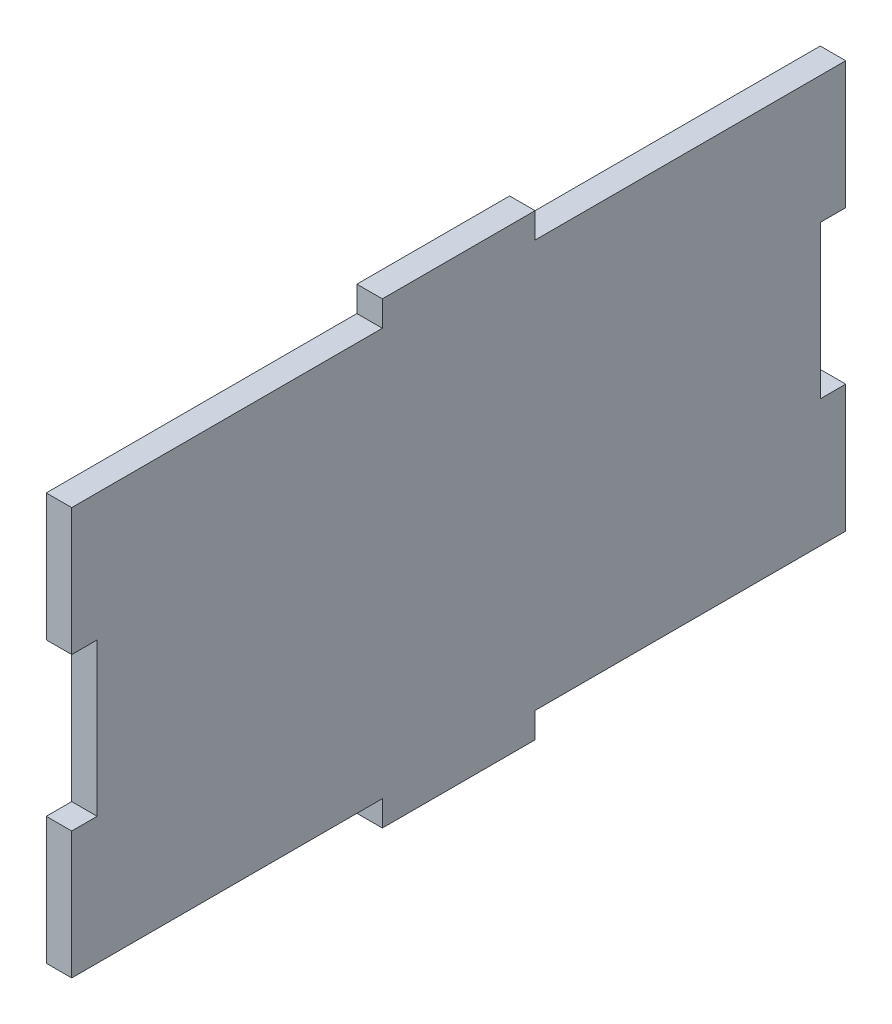
ISO-10303-21;
HEADER;
FILE_DESCRIPTION(('STEP AP214'),'2;1');
FILE_NAME('part.step','',(''),(''),'','','');
FILE_SCHEMA(('AUTOMOTIVE_DESIGN { 1 0 10303 214 1 1 1 1 }'));
ENDSEC;
DATA;
#1=APPLICATION_CONTEXT('core data for automotive mechanical design processes');
#2=APPLICATION_PROTOCOL_DEFINITION('international standard','automotive_design',2000,#1);
#3=PRODUCT_CONTEXT('',#1,'mechanical');
#4=PRODUCT('Part','Part','',(#3));
#5=PRODUCT_RELATED_PRODUCT_CATEGORY('part','',(#4));
#6=PRODUCT_DEFINITION_FORMATION('','',#4);
#7=PRODUCT_DEFINITION_CONTEXT('part definition',#1,'design');
#8=PRODUCT_DEFINITION('design','',#6,#7);
#9=PRODUCT_DEFINITION_SHAPE('','',#8);
#10=(LENGTH_UNIT() NAMED_UNIT(*) SI_UNIT(.MILLI.,.METRE.));
#11=(NAMED_UNIT(*) PLANE_ANGLE_UNIT() SI_UNIT($,.RADIAN.));
#12=(NAMED_UNIT(*) SI_UNIT($,.STERADIAN.) SOLID_ANGLE_UNIT());
#13=UNCERTAINTY_MEASURE_WITH_UNIT(LENGTH_MEASURE(1.E-05),#10,'distance_accuracy_value','');
#14=(GEOMETRIC_REPRESENTATION_CONTEXT(3) GLOBAL_UNCERTAINTY_ASSIGNED_CONTEXT((#13)) GLOBAL_UNIT_ASSIGNED_CONTEXT((#10,
#11,#12)) REPRESENTATION_CONTEXT('',''));
#15=CARTESIAN_POINT('',(0.,0.,0.));
#16=DIRECTION('',(0.,0.,1.));
#17=DIRECTION('',(1.,0.,0.));
#18=AXIS2_PLACEMENT_3D('',#15,#16,#17);
#19=CARTESIAN_POINT('',(3.175,0.,0.));
#20=DIRECTION('',(0.,0.,-1.));
#21=DIRECTION('',(-1.,0.,0.));
#22=AXIS2_PLACEMENT_3D('',#19,#20,#21);
#23=PLANE('',#22);
#24=DIRECTION('',(0.,-1.,0.));
#25=VECTOR('',#24,1.);
#26=CARTESIAN_POINT('',(0.,0.,0.));
#27=LINE('',#26,#25);
#28=CARTESIAN_POINT('',(0.,15.875,0.));
#29=VERTEX_POINT('',#28);
#30=CARTESIAN_POINT('',(0.,0.,0.));
#31=VERTEX_POINT('',#30);
#32=EDGE_CURVE('E200',#29,#31,#27,.T.);
#33=ORIENTED_EDGE('',*,*,#32,.T.);
#34=DIRECTION('',(-1.,0.,0.));
#35=VECTOR('',#34,1.);
#36=CARTESIAN_POINT('',(3.175,0.,0.));
#37=LINE('',#36,#35);
#38=CARTESIAN_POINT('',(3.175,0.,0.));
#39=VERTEX_POINT('',#38);
#40=EDGE_CURVE('E11',#39,#31,#37,.T.);
#41=ORIENTED_EDGE('',*,*,#40,.F.);
#42=DIRECTION('',(0.,-1.,0.));
#43=VECTOR('',#42,1.);
#44=CARTESIAN_POINT('',(3.175,0.,0.));
#45=LINE('',#44,#43);
#46=CARTESIAN_POINT('',(3.175,15.875,0.));
#47=VERTEX_POINT('',#46);
#48=EDGE_CURVE('E238',#47,#39,#45,.T.);
#49=ORIENTED_EDGE('',*,*,#48,.F.);
#50=DIRECTION('',(-1.,0.,0.));
#51=VECTOR('',#50,1.);
#52=CARTESIAN_POINT('',(3.175,15.875,0.));
#53=LINE('',#52,#51);
#54=EDGE_CURVE('E196',#47,#29,#53,.T.);
#55=ORIENTED_EDGE('',*,*,#54,.T.);
#56=EDGE_LOOP('',(#33,#41,#49,#55));
#57=FACE_BOUND('',#56,.T.);
#58=ADVANCED_FACE('F32',(#57),#23,.F.);
#59=CARTESIAN_POINT('',(3.175,0.,0.));
#60=DIRECTION('',(0.,1.,0.));
#61=DIRECTION('',(0.,0.,1.));
#62=AXIS2_PLACEMENT_3D('',#59,#60,#61);
#63=PLANE('',#62);
#64=DIRECTION('',(0.,0.,-1.));
#65=VECTOR('',#64,1.);
#66=CARTESIAN_POINT('',(0.,0.,0.));
#67=LINE('',#66,#65);
#68=CARTESIAN_POINT('',(0.,0.,-38.735));
#69=VERTEX_POINT('',#68);
#70=EDGE_CURVE('E203',#31,#69,#67,.T.);
#71=ORIENTED_EDGE('',*,*,#70,.T.);
#72=DIRECTION('',(-1.,0.,0.));
#73=VECTOR('',#72,1.);
#74=CARTESIAN_POINT('',(3.175,0.,-38.735));
#75=LINE('',#74,#73);
#76=CARTESIAN_POINT('',(3.175,0.,-38.735));
#77=VERTEX_POINT('',#76);
#78=EDGE_CURVE('E40',#77,#69,#75,.T.);
#79=ORIENTED_EDGE('',*,*,#78,.F.);
#80=DIRECTION('',(0.,0.,-1.));
#81=VECTOR('',#80,1.);
#82=CARTESIAN_POINT('',(3.175,0.,0.));
#83=LINE('',#82,#81);
#84=EDGE_CURVE('E127',#39,#77,#83,.T.);
#85=ORIENTED_EDGE('',*,*,#84,.F.);
#86=ORIENTED_EDGE('',*,*,#40,.T.);
#87=EDGE_LOOP('',(#71,#79,#85,#86));
#88=FACE_BOUND('',#87,.T.);
#89=ADVANCED_FACE('F356',(#88),#63,.F.);
#90=CARTESIAN_POINT('',(3.175,0.,-38.735));
#91=DIRECTION('',(0.,0.,-1.));
#92=DIRECTION('',(-1.,0.,0.));
#93=AXIS2_PLACEMENT_3D('',#90,#91,#92);
#94=PLANE('',#93);
#95=DIRECTION('',(0.,-1.,0.));
#96=VECTOR('',#95,1.);
#97=CARTESIAN_POINT('',(0.,0.,-38.735));
#98=LINE('',#97,#96);
#99=CARTESIAN_POINT('',(0.,-3.175,-38.735));
#100=VERTEX_POINT('',#99);
#101=EDGE_CURVE('E205',#69,#100,#98,.T.);
#102=ORIENTED_EDGE('',*,*,#101,.T.);
#103=DIRECTION('',(-1.,0.,0.));
#104=VECTOR('',#103,1.);
#105=CARTESIAN_POINT('',(3.175,-3.175,-38.735));
#106=LINE('',#105,#104);
#107=CARTESIAN_POINT('',(3.175,-3.175,-38.735));
#108=VERTEX_POINT('',#107);
#109=EDGE_CURVE('E281',#108,#100,#106,.T.);
#110=ORIENTED_EDGE('',*,*,#109,.F.);
#111=DIRECTION('',(0.,-1.,0.));
#112=VECTOR('',#111,1.);
#113=CARTESIAN_POINT('',(3.175,0.,-38.735));
#114=LINE('',#113,#112);
#115=EDGE_CURVE('E289',#77,#108,#114,.T.);
#116=ORIENTED_EDGE('',*,*,#115,.F.);
#117=ORIENTED_EDGE('',*,*,#78,.T.);
#118=EDGE_LOOP('',(#102,#110,#116,#117));
#119=FACE_BOUND('',#118,.T.);
#120=ADVANCED_FACE('F287',(#119),#94,.F.);
#121=CARTESIAN_POINT('',(3.175,-3.175,-38.735));
#122=DIRECTION('',(0.,1.,0.));
#123=DIRECTION('',(0.,0.,1.));
#124=AXIS2_PLACEMENT_3D('',#121,#122,#123);
#125=PLANE('',#124);
#126=DIRECTION('',(0.,0.,-1.));
#127=VECTOR('',#126,1.);
#128=CARTESIAN_POINT('',(0.,-3.175,-38.735));
#129=LINE('',#128,#127);
#130=CARTESIAN_POINT('',(0.,-3.175,-57.785));
#131=VERTEX_POINT('',#130);
#132=EDGE_CURVE('E207',#100,#131,#129,.T.);
#133=ORIENTED_EDGE('',*,*,#132,.T.);
#134=DIRECTION('',(-1.,0.,0.));
#135=VECTOR('',#134,1.);
#136=CARTESIAN_POINT('',(3.175,-3.175,-57.785));
#137=LINE('',#136,#135);
#138=CARTESIAN_POINT('',(3.175,-3.175,-57.785));
#139=VERTEX_POINT('',#138);
#140=EDGE_CURVE('E278',#139,#131,#137,.T.);
#141=ORIENTED_EDGE('',*,*,#140,.F.);
#142=DIRECTION('',(0.,0.,-1.));
#143=VECTOR('',#142,1.);
#144=CARTESIAN_POINT('',(3.175,-3.175,-38.735));
#145=LINE('',#144,#143);
#146=EDGE_CURVE('E307',#108,#139,#145,.T.);
#147=ORIENTED_EDGE('',*,*,#146,.F.);
#148=ORIENTED_EDGE('',*,*,#109,.T.);
#149=EDGE_LOOP('',(#133,#141,#147,#148));
#150=FACE_BOUND('',#149,.T.);
#151=ADVANCED_FACE('F298',(#150),#125,.F.);
#152=CARTESIAN_POINT('',(3.175,-3.175,-57.785));
#153=DIRECTION('',(0.,0.,1.));
#154=DIRECTION('',(1.,0.,0.));
#155=AXIS2_PLACEMENT_3D('',#152,#153,#154);
#156=PLANE('',#155);
#157=DIRECTION('',(0.,1.,0.));
#158=VECTOR('',#157,1.);
#159=CARTESIAN_POINT('',(0.,-3.175,-57.785));
#160=LINE('',#159,#158);
#161=CARTESIAN_POINT('',(0.,0.,-57.785));
#162=VERTEX_POINT('',#161);
#163=EDGE_CURVE('E209',#131,#162,#160,.T.);
#164=ORIENTED_EDGE('',*,*,#163,.T.);
#165=DIRECTION('',(-1.,0.,0.));
#166=VECTOR('',#165,1.);
#167=CARTESIAN_POINT('',(3.175,0.,-57.785));
#168=LINE('',#167,#166);
#169=CARTESIAN_POINT('',(3.175,0.,-57.785));
#170=VERTEX_POINT('',#169);
#171=EDGE_CURVE('E275',#170,#162,#168,.T.);
#172=ORIENTED_EDGE('',*,*,#171,.F.);
#173=DIRECTION('',(0.,1.,0.));
#174=VECTOR('',#173,1.);
#175=CARTESIAN_POINT('',(3.175,-3.175,-57.785));
#176=LINE('',#175,#174);
#177=EDGE_CURVE('E304',#139,#170,#176,.T.);
#178=ORIENTED_EDGE('',*,*,#177,.F.);
#179=ORIENTED_EDGE('',*,*,#140,.T.);
#180=EDGE_LOOP('',(#164,#172,#178,#179));
#181=FACE_BOUND('',#180,.T.);
#182=ADVANCED_FACE('F302',(#181),#156,.F.);
#183=CARTESIAN_POINT('',(3.175,0.,-57.785));
#184=DIRECTION('',(0.,1.,0.));
#185=DIRECTION('',(0.,0.,1.));
#186=AXIS2_PLACEMENT_3D('',#183,#184,#185);
#187=PLANE('',#186);
#188=DIRECTION('',(0.,0.,-1.));
#189=VECTOR('',#188,1.);
#190=CARTESIAN_POINT('',(0.,0.,-57.785));
#191=LINE('',#190,#189);
#192=CARTESIAN_POINT('',(0.,0.,-96.52));
#193=VERTEX_POINT('',#192);
#194=EDGE_CURVE('E211',#162,#193,#191,.T.);
#195=ORIENTED_EDGE('',*,*,#194,.T.);
#196=DIRECTION('',(-1.,0.,0.));
#197=VECTOR('',#196,1.);
#198=CARTESIAN_POINT('',(3.175,0.,-96.52));
#199=LINE('',#198,#197);
#200=CARTESIAN_POINT('',(3.175,0.,-96.52));
#201=VERTEX_POINT('',#200);
#202=EDGE_CURVE('E272',#201,#193,#199,.T.);
#203=ORIENTED_EDGE('',*,*,#202,.F.);
#204=DIRECTION('',(0.,0.,-1.));
#205=VECTOR('',#204,1.);
#206=CARTESIAN_POINT('',(3.175,0.,-57.785));
#207=LINE('',#206,#205);
#208=EDGE_CURVE('E306',#170,#201,#207,.T.);
#209=ORIENTED_EDGE('',*,*,#208,.F.);
#210=ORIENTED_EDGE('',*,*,#171,.T.);
#211=EDGE_LOOP('',(#195,#203,#209,#210));
#212=FACE_BOUND('',#211,.T.);
#213=ADVANCED_FACE('F369',(#212),#187,.F.);
#214=CARTESIAN_POINT('',(3.175,0.,-96.52));
#215=DIRECTION('',(0.,0.,1.));
#216=DIRECTION('',(1.,0.,0.));
#217=AXIS2_PLACEMENT_3D('',#214,#215,#216);
#218=PLANE('',#217);
#219=DIRECTION('',(0.,1.,0.));
#220=VECTOR('',#219,1.);
#221=CARTESIAN_POINT('',(0.,0.,-96.52));
#222=LINE('',#221,#220);
#223=CARTESIAN_POINT('',(0.,15.875,-96.52));
#224=VERTEX_POINT('',#223);
#225=EDGE_CURVE('E213',#193,#224,#222,.T.);
#226=ORIENTED_EDGE('',*,*,#225,.T.);
#227=DIRECTION('',(-1.,0.,0.));
#228=VECTOR('',#227,1.);
#229=CARTESIAN_POINT('',(3.175,15.875,-96.52));
#230=LINE('',#229,#228);
#231=CARTESIAN_POINT('',(3.175,15.875,-96.52));
#232=VERTEX_POINT('',#231);
#233=EDGE_CURVE('E269',#232,#224,#230,.T.);
#234=ORIENTED_EDGE('',*,*,#233,.F.);
#235=DIRECTION('',(0.,1.,0.));
#236=VECTOR('',#235,1.);
#237=CARTESIAN_POINT('',(3.175,0.,-96.52));
#238=LINE('',#237,#236);
#239=EDGE_CURVE('E309',#201,#232,#238,.T.);
#240=ORIENTED_EDGE('',*,*,#239,.F.);
#241=ORIENTED_EDGE('',*,*,#202,.T.);
#242=EDGE_LOOP('',(#226,#234,#240,#241));
#243=FACE_BOUND('',#242,.T.);
#244=ADVANCED_FACE('F372',(#243),#218,.F.);
#245=CARTESIAN_POINT('',(3.175,15.875,-93.345));
#246=DIRECTION('',(0.,-1.,0.));
#247=DIRECTION('',(0.,0.,-1.));
#248=AXIS2_PLACEMENT_3D('',#245,#246,#247);
#249=PLANE('',#248);
#250=DIRECTION('',(0.,0.,1.));
#251=VECTOR('',#250,1.);
#252=CARTESIAN_POINT('',(0.,15.875,-93.345));
#253=LINE('',#252,#251);
#254=CARTESIAN_POINT('',(0.,15.875,-93.345));
#255=VERTEX_POINT('',#254);
#256=EDGE_CURVE('E215',#224,#255,#253,.T.);
#257=ORIENTED_EDGE('',*,*,#256,.T.);
#258=DIRECTION('',(-1.,0.,0.));
#259=VECTOR('',#258,1.);
#260=CARTESIAN_POINT('',(3.175,15.875,-93.345));
#261=LINE('',#260,#259);
#262=CARTESIAN_POINT('',(3.175,15.875,-93.345));
#263=VERTEX_POINT('',#262);
#264=EDGE_CURVE('E266',#263,#255,#261,.T.);
#265=ORIENTED_EDGE('',*,*,#264,.F.);
#266=DIRECTION('',(0.,0.,1.));
#267=VECTOR('',#266,1.);
#268=CARTESIAN_POINT('',(3.175,15.875,-93.345));
#269=LINE('',#268,#267);
#270=EDGE_CURVE('E315',#232,#263,#269,.T.);
#271=ORIENTED_EDGE('',*,*,#270,.F.);
#272=ORIENTED_EDGE('',*,*,#233,.T.);
#273=EDGE_LOOP('',(#257,#265,#271,#272));
#274=FACE_BOUND('',#273,.T.);
#275=ADVANCED_FACE('F376',(#274),#249,.F.);
#276=CARTESIAN_POINT('',(3.175,34.925,-93.345));
#277=DIRECTION('',(0.,0.,1.));
#278=DIRECTION('',(0.,-1.,0.));
#279=AXIS2_PLACEMENT_3D('',#276,#277,#278);
#280=PLANE('',#279);
#281=DIRECTION('',(0.,1.,0.));
#282=VECTOR('',#281,1.);
#283=CARTESIAN_POINT('',(0.,34.925,-93.345));
#284=LINE('',#283,#282);
#285=CARTESIAN_POINT('',(0.,34.925,-93.345));
#286=VERTEX_POINT('',#285);
#287=EDGE_CURVE('E217',#255,#286,#284,.T.);
#288=ORIENTED_EDGE('',*,*,#287,.T.);
#289=DIRECTION('',(-1.,0.,0.));
#290=VECTOR('',#289,1.);
#291=CARTESIAN_POINT('',(3.175,34.925,-93.345));
#292=LINE('',#291,#290);
#293=CARTESIAN_POINT('',(3.175,34.925,-93.345));
#294=VERTEX_POINT('',#293);
#295=EDGE_CURVE('E263',#294,#286,#292,.T.);
#296=ORIENTED_EDGE('',*,*,#295,.F.);
#297=DIRECTION('',(0.,1.,0.));
#298=VECTOR('',#297,1.);
#299=CARTESIAN_POINT('',(3.175,34.925,-93.345));
#300=LINE('',#299,#298);
#301=EDGE_CURVE('E317',#263,#294,#300,.T.);
#302=ORIENTED_EDGE('',*,*,#301,.F.);
#303=ORIENTED_EDGE('',*,*,#264,.T.);
#304=EDGE_LOOP('',(#288,#296,#302,#303));
#305=FACE_BOUND('',#304,.T.);
#306=ADVANCED_FACE('F380',(#305),#280,.F.);
#307=CARTESIAN_POINT('',(3.175,34.925,-96.52));
#308=DIRECTION('',(0.,1.,0.));
#309=DIRECTION('',(0.,0.,1.));
#310=AXIS2_PLACEMENT_3D('',#307,#308,#309);
#311=PLANE('',#310);
#312=DIRECTION('',(0.,0.,-1.));
#313=VECTOR('',#312,1.);
#314=CARTESIAN_POINT('',(0.,34.925,-96.52));
#315=LINE('',#314,#313);
#316=CARTESIAN_POINT('',(0.,34.925,-96.52));
#317=VERTEX_POINT('',#316);
#318=EDGE_CURVE('E219',#286,#317,#315,.T.);
#319=ORIENTED_EDGE('',*,*,#318,.T.);
#320=DIRECTION('',(-1.,0.,0.));
#321=VECTOR('',#320,1.);
#322=CARTESIAN_POINT('',(3.175,34.925,-96.52));
#323=LINE('',#322,#321);
#324=CARTESIAN_POINT('',(3.175,34.925,-96.52));
#325=VERTEX_POINT('',#324);
#326=EDGE_CURVE('E260',#325,#317,#323,.T.);
#327=ORIENTED_EDGE('',*,*,#326,.F.);
#328=DIRECTION('',(0.,0.,-1.));
#329=VECTOR('',#328,1.);
#330=CARTESIAN_POINT('',(3.175,34.925,-96.52));
#331=LINE('',#330,#329);
#332=EDGE_CURVE('E319',#294,#325,#331,.T.);
#333=ORIENTED_EDGE('',*,*,#332,.F.);
#334=ORIENTED_EDGE('',*,*,#295,.T.);
#335=EDGE_LOOP('',(#319,#327,#333,#334));
#336=FACE_BOUND('',#335,.T.);
#337=ADVANCED_FACE('F384',(#336),#311,.F.);
#338=CARTESIAN_POINT('',(3.175,34.925,-96.52));
#339=DIRECTION('',(0.,0.,1.));
#340=DIRECTION('',(0.,-1.,0.));
#341=AXIS2_PLACEMENT_3D('',#338,#339,#340);
#342=PLANE('',#341);
#343=DIRECTION('',(0.,1.,0.));
#344=VECTOR('',#343,1.);
#345=CARTESIAN_POINT('',(0.,34.925,-96.52));
#346=LINE('',#345,#344);
#347=CARTESIAN_POINT('',(0.,50.8,-96.52));
#348=VERTEX_POINT('',#347);
#349=EDGE_CURVE('E221',#317,#348,#346,.T.);
#350=ORIENTED_EDGE('',*,*,#349,.T.);
#351=DIRECTION('',(-1.,0.,0.));
#352=VECTOR('',#351,1.);
#353=CARTESIAN_POINT('',(3.175,50.8,-96.52));
#354=LINE('',#353,#352);
#355=CARTESIAN_POINT('',(3.175,50.8,-96.52));
#356=VERTEX_POINT('',#355);
#357=EDGE_CURVE('E257',#356,#348,#354,.T.);
#358=ORIENTED_EDGE('',*,*,#357,.F.);
#359=DIRECTION('',(0.,1.,0.));
#360=VECTOR('',#359,1.);
#361=CARTESIAN_POINT('',(3.175,34.925,-96.52));
#362=LINE('',#361,#360);
#363=EDGE_CURVE('E321',#325,#356,#362,.T.);
#364=ORIENTED_EDGE('',*,*,#363,.F.);
#365=ORIENTED_EDGE('',*,*,#326,.T.);
#366=EDGE_LOOP('',(#350,#358,#364,#365));
#367=FACE_BOUND('',#366,.T.);
#368=ADVANCED_FACE('F388',(#367),#342,.F.);
#369=CARTESIAN_POINT('',(3.175,50.8,-57.785));
#370=DIRECTION('',(0.,-1.,0.));
#371=DIRECTION('',(0.,0.,-1.));
#372=AXIS2_PLACEMENT_3D('',#369,#370,#371);
#373=PLANE('',#372);
#374=DIRECTION('',(0.,0.,1.));
#375=VECTOR('',#374,1.);
#376=CARTESIAN_POINT('',(0.,50.8,-57.785));
#377=LINE('',#376,#375);
#378=CARTESIAN_POINT('',(0.,50.8,-57.785));
#379=VERTEX_POINT('',#378);
#380=EDGE_CURVE('E223',#348,#379,#377,.T.);
#381=ORIENTED_EDGE('',*,*,#380,.T.);
#382=DIRECTION('',(-1.,0.,0.));
#383=VECTOR('',#382,1.);
#384=CARTESIAN_POINT('',(3.175,50.8,-57.785));
#385=LINE('',#384,#383);
#386=CARTESIAN_POINT('',(3.175,50.8,-57.785));
#387=VERTEX_POINT('',#386);
#388=EDGE_CURVE('E254',#387,#379,#385,.T.);
#389=ORIENTED_EDGE('',*,*,#388,.F.);
#390=DIRECTION('',(0.,0.,1.));
#391=VECTOR('',#390,1.);
#392=CARTESIAN_POINT('',(3.175,50.8,-57.785));
#393=LINE('',#392,#391);
#394=EDGE_CURVE('E323',#356,#387,#393,.T.);
#395=ORIENTED_EDGE('',*,*,#394,.F.);
#396=ORIENTED_EDGE('',*,*,#357,.T.);
#397=EDGE_LOOP('',(#381,#389,#395,#396));
#398=FACE_BOUND('',#397,.T.);
#399=ADVANCED_FACE('F392',(#398),#373,.F.);
#400=CARTESIAN_POINT('',(3.175,53.975,-57.785));
#401=DIRECTION('',(0.,0.,1.));
#402=DIRECTION('',(1.,0.,0.));
#403=AXIS2_PLACEMENT_3D('',#400,#401,#402);
#404=PLANE('',#403);
#405=DIRECTION('',(0.,1.,0.));
#406=VECTOR('',#405,1.);
#407=CARTESIAN_POINT('',(0.,53.975,-57.785));
#408=LINE('',#407,#406);
#409=CARTESIAN_POINT('',(0.,53.975,-57.785));
#410=VERTEX_POINT('',#409);
#411=EDGE_CURVE('E225',#379,#410,#408,.T.);
#412=ORIENTED_EDGE('',*,*,#411,.T.);
#413=DIRECTION('',(-1.,0.,0.));
#414=VECTOR('',#413,1.);
#415=CARTESIAN_POINT('',(3.175,53.975,-57.785));
#416=LINE('',#415,#414);
#417=CARTESIAN_POINT('',(3.175,53.975,-57.785));
#418=VERTEX_POINT('',#417);
#419=EDGE_CURVE('E251',#418,#410,#416,.T.);
#420=ORIENTED_EDGE('',*,*,#419,.F.);
#421=DIRECTION('',(0.,1.,0.));
#422=VECTOR('',#421,1.);
#423=CARTESIAN_POINT('',(3.175,53.975,-57.785));
#424=LINE('',#423,#422);
#425=EDGE_CURVE('E325',#387,#418,#424,.T.);
#426=ORIENTED_EDGE('',*,*,#425,.F.);
#427=ORIENTED_EDGE('',*,*,#388,.T.);
#428=EDGE_LOOP('',(#412,#420,#426,#427));
#429=FACE_BOUND('',#428,.T.);
#430=ADVANCED_FACE('F396',(#429),#404,.F.);
#431=CARTESIAN_POINT('',(3.175,53.975,-38.735));
#432=DIRECTION('',(0.,-1.,0.));
#433=DIRECTION('',(0.,0.,-1.));
#434=AXIS2_PLACEMENT_3D('',#431,#432,#433);
#435=PLANE('',#434);
#436=DIRECTION('',(0.,0.,1.));
#437=VECTOR('',#436,1.);
#438=CARTESIAN_POINT('',(0.,53.975,-38.735));
#439=LINE('',#438,#437);
#440=CARTESIAN_POINT('',(0.,53.975,-38.735));
#441=VERTEX_POINT('',#440);
#442=EDGE_CURVE('E227',#410,#441,#439,.T.);
#443=ORIENTED_EDGE('',*,*,#442,.T.);
#444=DIRECTION('',(-1.,0.,0.));
#445=VECTOR('',#444,1.);
#446=CARTESIAN_POINT('',(3.175,53.975,-38.735));
#447=LINE('',#446,#445);
#448=CARTESIAN_POINT('',(3.175,53.975,-38.735));
#449=VERTEX_POINT('',#448);
#450=EDGE_CURVE('E248',#449,#441,#447,.T.);
#451=ORIENTED_EDGE('',*,*,#450,.F.);
#452=DIRECTION('',(0.,0.,1.));
#453=VECTOR('',#452,1.);
#454=CARTESIAN_POINT('',(3.175,53.975,-38.735));
#455=LINE('',#454,#453);
#456=EDGE_CURVE('E327',#418,#449,#455,.T.);
#457=ORIENTED_EDGE('',*,*,#456,.F.);
#458=ORIENTED_EDGE('',*,*,#419,.T.);
#459=EDGE_LOOP('',(#443,#451,#457,#458));
#460=FACE_BOUND('',#459,.T.);
#461=ADVANCED_FACE('F400',(#460),#435,.F.);
#462=CARTESIAN_POINT('',(3.175,50.8,-38.735));
#463=DIRECTION('',(0.,0.,-1.));
#464=DIRECTION('',(-1.,0.,0.));
#465=AXIS2_PLACEMENT_3D('',#462,#463,#464);
#466=PLANE('',#465);
#467=DIRECTION('',(0.,-1.,0.));
#468=VECTOR('',#467,1.);
#469=CARTESIAN_POINT('',(0.,50.8,-38.735));
#470=LINE('',#469,#468);
#471=CARTESIAN_POINT('',(0.,50.8,-38.735));
#472=VERTEX_POINT('',#471);
#473=EDGE_CURVE('E229',#441,#472,#470,.T.);
#474=ORIENTED_EDGE('',*,*,#473,.T.);
#475=DIRECTION('',(-1.,0.,0.));
#476=VECTOR('',#475,1.);
#477=CARTESIAN_POINT('',(3.175,50.8,-38.735));
#478=LINE('',#477,#476);
#479=CARTESIAN_POINT('',(3.175,50.8,-38.735));
#480=VERTEX_POINT('',#479);
#481=EDGE_CURVE('E245',#480,#472,#478,.T.);
#482=ORIENTED_EDGE('',*,*,#481,.F.);
#483=DIRECTION('',(0.,-1.,0.));
#484=VECTOR('',#483,1.);
#485=CARTESIAN_POINT('',(3.175,50.8,-38.735));
#486=LINE('',#485,#484);
#487=EDGE_CURVE('E329',#449,#480,#486,.T.);
#488=ORIENTED_EDGE('',*,*,#487,.F.);
#489=ORIENTED_EDGE('',*,*,#450,.T.);
#490=EDGE_LOOP('',(#474,#482,#488,#489));
#491=FACE_BOUND('',#490,.T.);
#492=ADVANCED_FACE('F404',(#491),#466,.F.);
#493=CARTESIAN_POINT('',(3.175,50.8,0.));
#494=DIRECTION('',(0.,-1.,0.));
#495=DIRECTION('',(0.,0.,-1.));
#496=AXIS2_PLACEMENT_3D('',#493,#494,#495);
#497=PLANE('',#496);
#498=DIRECTION('',(0.,0.,1.));
#499=VECTOR('',#498,1.);
#500=CARTESIAN_POINT('',(0.,50.8,0.));
#501=LINE('',#500,#499);
#502=CARTESIAN_POINT('',(0.,50.8,0.));
#503=VERTEX_POINT('',#502);
#504=EDGE_CURVE('E231',#472,#503,#501,.T.);
#505=ORIENTED_EDGE('',*,*,#504,.T.);
#506=DIRECTION('',(-1.,0.,0.));
#507=VECTOR('',#506,1.);
#508=CARTESIAN_POINT('',(3.175,50.8,0.));
#509=LINE('',#508,#507);
#510=CARTESIAN_POINT('',(3.175,50.8,0.));
#511=VERTEX_POINT('',#510);
#512=EDGE_CURVE('E242',#511,#503,#509,.T.);
#513=ORIENTED_EDGE('',*,*,#512,.F.);
#514=DIRECTION('',(0.,0.,1.));
#515=VECTOR('',#514,1.);
#516=CARTESIAN_POINT('',(3.175,50.8,0.));
#517=LINE('',#516,#515);
#518=EDGE_CURVE('E331',#480,#511,#517,.T.);
#519=ORIENTED_EDGE('',*,*,#518,.F.);
#520=ORIENTED_EDGE('',*,*,#481,.T.);
#521=EDGE_LOOP('',(#505,#513,#519,#520));
#522=FACE_BOUND('',#521,.T.);
#523=ADVANCED_FACE('F337',(#522),#497,.F.);
#524=CARTESIAN_POINT('',(3.175,34.925,0.));
#525=DIRECTION('',(0.,0.,-1.));
#526=DIRECTION('',(-1.,0.,0.));
#527=AXIS2_PLACEMENT_3D('',#524,#525,#526);
#528=PLANE('',#527);
#529=DIRECTION('',(0.,-1.,0.));
#530=VECTOR('',#529,1.);
#531=CARTESIAN_POINT('',(0.,34.925,0.));
#532=LINE('',#531,#530);
#533=CARTESIAN_POINT('',(0.,34.925,0.));
#534=VERTEX_POINT('',#533);
#535=EDGE_CURVE('E233',#503,#534,#532,.T.);
#536=ORIENTED_EDGE('',*,*,#535,.T.);
#537=DIRECTION('',(-1.,0.,0.));
#538=VECTOR('',#537,1.);
#539=CARTESIAN_POINT('',(3.175,34.925,0.));
#540=LINE('',#539,#538);
#541=CARTESIAN_POINT('',(3.175,34.925,0.));
#542=VERTEX_POINT('',#541);
#543=EDGE_CURVE('E191',#542,#534,#540,.T.);
#544=ORIENTED_EDGE('',*,*,#543,.F.);
#545=DIRECTION('',(0.,-1.,0.));
#546=VECTOR('',#545,1.);
#547=CARTESIAN_POINT('',(3.175,34.925,0.));
#548=LINE('',#547,#546);
#549=EDGE_CURVE('E182',#511,#542,#548,.T.);
#550=ORIENTED_EDGE('',*,*,#549,.F.);
#551=ORIENTED_EDGE('',*,*,#512,.T.);
#552=EDGE_LOOP('',(#536,#544,#550,#551));
#553=FACE_BOUND('',#552,.T.);
#554=ADVANCED_FACE('F341',(#553),#528,.F.);
#555=CARTESIAN_POINT('',(3.175,34.925,0.));
#556=DIRECTION('',(0.,1.,0.));
#557=DIRECTION('',(0.,0.,1.));
#558=AXIS2_PLACEMENT_3D('',#555,#556,#557);
#559=PLANE('',#558);
#560=DIRECTION('',(0.,0.,-1.));
#561=VECTOR('',#560,1.);
#562=CARTESIAN_POINT('',(0.,34.925,0.));
#563=LINE('',#562,#561);
#564=CARTESIAN_POINT('',(0.,34.925,-3.175));
#565=VERTEX_POINT('',#564);
#566=EDGE_CURVE('E190',#534,#565,#563,.T.);
#567=ORIENTED_EDGE('',*,*,#566,.T.);
#568=DIRECTION('',(-1.,0.,0.));
#569=VECTOR('',#568,1.);
#570=CARTESIAN_POINT('',(3.175,34.925,-3.175));
#571=LINE('',#570,#569);
#572=CARTESIAN_POINT('',(3.175,34.925,-3.175));
#573=VERTEX_POINT('',#572);
#574=EDGE_CURVE('E187',#573,#565,#571,.T.);
#575=ORIENTED_EDGE('',*,*,#574,.F.);
#576=DIRECTION('',(0.,0.,-1.));
#577=VECTOR('',#576,1.);
#578=CARTESIAN_POINT('',(3.175,34.925,0.));
#579=LINE('',#578,#577);
#580=EDGE_CURVE('E176',#542,#573,#579,.T.);
#581=ORIENTED_EDGE('',*,*,#580,.F.);
#582=ORIENTED_EDGE('',*,*,#543,.T.);
#583=EDGE_LOOP('',(#567,#575,#581,#582));
#584=FACE_BOUND('',#583,.T.);
#585=ADVANCED_FACE('F188',(#584),#559,.F.);
#586=CARTESIAN_POINT('',(3.175,34.925,-3.175));
#587=DIRECTION('',(0.,0.,-1.));
#588=DIRECTION('',(-1.,0.,0.));
#589=AXIS2_PLACEMENT_3D('',#586,#587,#588);
#590=PLANE('',#589);
#591=DIRECTION('',(0.,-1.,0.));
#592=VECTOR('',#591,1.);
#593=CARTESIAN_POINT('',(0.,34.925,-3.175));
#594=LINE('',#593,#592);
#595=CARTESIAN_POINT('',(0.,15.875,-3.175));
#596=VERTEX_POINT('',#595);
#597=EDGE_CURVE('E113',#565,#596,#594,.T.);
#598=ORIENTED_EDGE('',*,*,#597,.T.);
#599=DIRECTION('',(-1.,0.,0.));
#600=VECTOR('',#599,1.);
#601=CARTESIAN_POINT('',(3.175,15.875,-3.175));
#602=LINE('',#601,#600);
#603=CARTESIAN_POINT('',(3.175,15.875,-3.175));
#604=VERTEX_POINT('',#603);
#605=EDGE_CURVE('E192',#604,#596,#602,.T.);
#606=ORIENTED_EDGE('',*,*,#605,.F.);
#607=DIRECTION('',(0.,-1.,0.));
#608=VECTOR('',#607,1.);
#609=CARTESIAN_POINT('',(3.175,34.925,-3.175));
#610=LINE('',#609,#608);
#611=EDGE_CURVE('E180',#573,#604,#610,.T.);
#612=ORIENTED_EDGE('',*,*,#611,.F.);
#613=ORIENTED_EDGE('',*,*,#574,.T.);
#614=EDGE_LOOP('',(#598,#606,#612,#613));
#615=FACE_BOUND('',#614,.T.);
#616=ADVANCED_FACE('F194',(#615),#590,.F.);
#617=CARTESIAN_POINT('',(3.175,15.875,-3.175));
#618=DIRECTION('',(0.,-1.,0.));
#619=DIRECTION('',(0.,0.,-1.));
#620=AXIS2_PLACEMENT_3D('',#617,#618,#619);
#621=PLANE('',#620);
#622=DIRECTION('',(0.,0.,1.));
#623=VECTOR('',#622,1.);
#624=CARTESIAN_POINT('',(0.,15.875,-3.175));
#625=LINE('',#624,#623);
#626=EDGE_CURVE('E119',#596,#29,#625,.T.);
#627=ORIENTED_EDGE('',*,*,#626,.T.);
#628=ORIENTED_EDGE('',*,*,#54,.F.);
#629=DIRECTION('',(0.,0.,1.));
#630=VECTOR('',#629,1.);
#631=CARTESIAN_POINT('',(3.175,15.875,-3.175));
#632=LINE('',#631,#630);
#633=EDGE_CURVE('E48',#604,#47,#632,.T.);
#634=ORIENTED_EDGE('',*,*,#633,.F.);
#635=ORIENTED_EDGE('',*,*,#605,.T.);
#636=EDGE_LOOP('',(#627,#628,#634,#635));
#637=FACE_BOUND('',#636,.T.);
#638=ADVANCED_FACE('F345',(#637),#621,.F.);
#639=CARTESIAN_POINT('',(3.175,0.,0.));
#640=DIRECTION('',(1.,0.,0.));
#641=DIRECTION('',(0.,0.,-1.));
#642=AXIS2_PLACEMENT_3D('',#639,#640,#641);
#643=PLANE('',#642);
#644=ORIENTED_EDGE('',*,*,#48,.T.);
#645=ORIENTED_EDGE('',*,*,#84,.T.);
#646=ORIENTED_EDGE('',*,*,#115,.T.);
#647=ORIENTED_EDGE('',*,*,#146,.T.);
#648=ORIENTED_EDGE('',*,*,#177,.T.);
#649=ORIENTED_EDGE('',*,*,#208,.T.);
#650=ORIENTED_EDGE('',*,*,#239,.T.);
#651=ORIENTED_EDGE('',*,*,#270,.T.);
#652=ORIENTED_EDGE('',*,*,#301,.T.);
#653=ORIENTED_EDGE('',*,*,#332,.T.);
#654=ORIENTED_EDGE('',*,*,#363,.T.);
#655=ORIENTED_EDGE('',*,*,#394,.T.);
#656=ORIENTED_EDGE('',*,*,#425,.T.);
#657=ORIENTED_EDGE('',*,*,#456,.T.);
#658=ORIENTED_EDGE('',*,*,#487,.T.);
#659=ORIENTED_EDGE('',*,*,#518,.T.);
#660=ORIENTED_EDGE('',*,*,#549,.T.);
#661=ORIENTED_EDGE('',*,*,#580,.T.);
#662=ORIENTED_EDGE('',*,*,#611,.T.);
#663=ORIENTED_EDGE('',*,*,#633,.T.);
#664=EDGE_LOOP('',(#644,#645,#646,#647,#648,#649,#650,#651,#652,#653,#654,#655,#656,#657,#658,
#659,#660,#661,#662,#663));
#665=FACE_BOUND('',#664,.T.);
#666=ADVANCED_FACE('F178',(#665),#643,.T.);
#667=CARTESIAN_POINT('',(0.,0.,0.));
#668=DIRECTION('',(1.,0.,0.));
#669=DIRECTION('',(0.,0.,-1.));
#670=AXIS2_PLACEMENT_3D('',#667,#668,#669);
#671=PLANE('',#670);
#672=ORIENTED_EDGE('',*,*,#32,.F.);
#673=ORIENTED_EDGE('',*,*,#626,.F.);
#674=ORIENTED_EDGE('',*,*,#597,.F.);
#675=ORIENTED_EDGE('',*,*,#566,.F.);
#676=ORIENTED_EDGE('',*,*,#535,.F.);
#677=ORIENTED_EDGE('',*,*,#504,.F.);
#678=ORIENTED_EDGE('',*,*,#473,.F.);
#679=ORIENTED_EDGE('',*,*,#442,.F.);
#680=ORIENTED_EDGE('',*,*,#411,.F.);
#681=ORIENTED_EDGE('',*,*,#380,.F.);
#682=ORIENTED_EDGE('',*,*,#349,.F.);
#683=ORIENTED_EDGE('',*,*,#318,.F.);
#684=ORIENTED_EDGE('',*,*,#287,.F.);
#685=ORIENTED_EDGE('',*,*,#256,.F.);
#686=ORIENTED_EDGE('',*,*,#225,.F.);
#687=ORIENTED_EDGE('',*,*,#194,.F.);
#688=ORIENTED_EDGE('',*,*,#163,.F.);
#689=ORIENTED_EDGE('',*,*,#132,.F.);
#690=ORIENTED_EDGE('',*,*,#101,.F.);
#691=ORIENTED_EDGE('',*,*,#70,.F.);
#692=EDGE_LOOP('',(#672,#673,#674,#675,#676,#677,#678,#679,#680,#681,#682,#683,#684,#685,#686,
#687,#688,#689,#690,#691));
#693=FACE_BOUND('',#692,.T.);
#694=ADVANCED_FACE('F293',(#693),#671,.F.);
#695=CLOSED_SHELL('',(#58,#89,#120,#151,#182,#213,#244,#275,#306,#337,#368,#399,#430,#461,#492,
#523,#554,#585,#616,#638,#666,#694));
#696=MANIFOLD_SOLID_BREP('B2',#695);
#697=ADVANCED_BREP_SHAPE_REPRESENTATION('',(#18,#696),#14);
#698=SHAPE_DEFINITION_REPRESENTATION(#9,#697);
ENDSEC;
END-ISO-10303-21;
